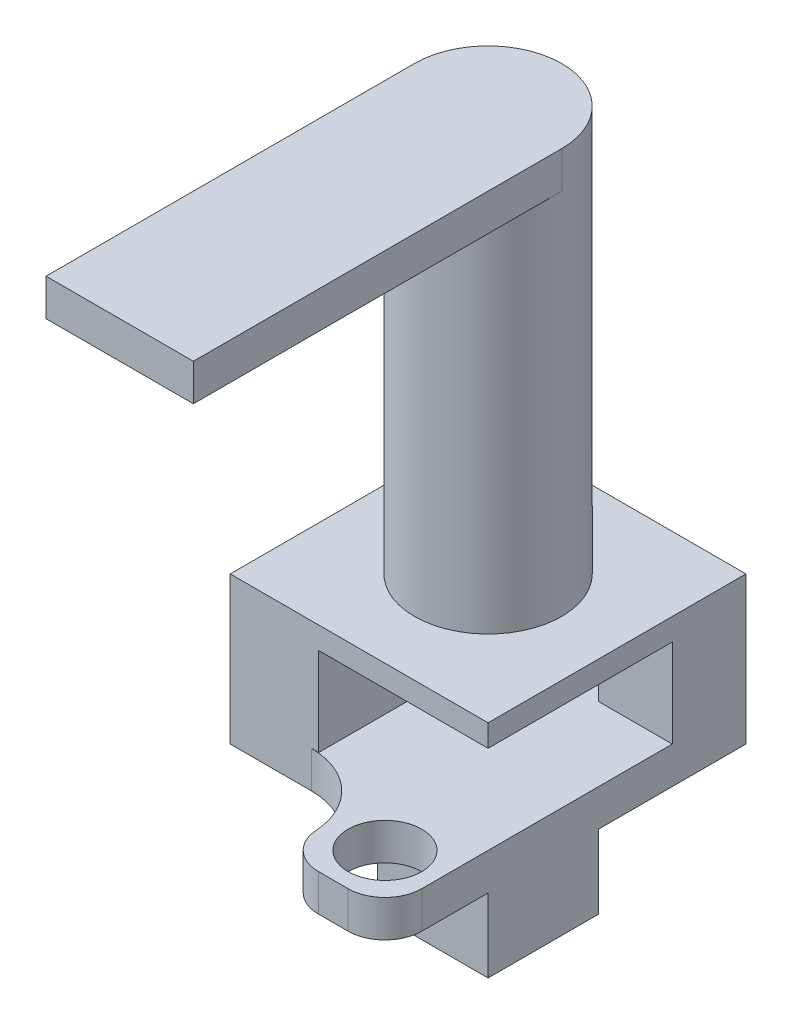
ISO-10303-21;
HEADER;
FILE_DESCRIPTION(('STEP AP214'),'2;1');
FILE_NAME('part.step','',(''),(''),'','','');
FILE_SCHEMA(('AUTOMOTIVE_DESIGN { 1 0 10303 214 1 1 1 1 }'));
ENDSEC;
DATA;
#1=APPLICATION_CONTEXT('core data for automotive mechanical design processes');
#2=APPLICATION_PROTOCOL_DEFINITION('international standard','automotive_design',2000,#1);
#3=PRODUCT_CONTEXT('',#1,'mechanical');
#4=PRODUCT('Part','Part','',(#3));
#5=PRODUCT_RELATED_PRODUCT_CATEGORY('part','',(#4));
#6=PRODUCT_DEFINITION_FORMATION('','',#4);
#7=PRODUCT_DEFINITION_CONTEXT('part definition',#1,'design');
#8=PRODUCT_DEFINITION('design','',#6,#7);
#9=PRODUCT_DEFINITION_SHAPE('','',#8);
#10=(LENGTH_UNIT() NAMED_UNIT(*) SI_UNIT(.MILLI.,.METRE.));
#11=(NAMED_UNIT(*) PLANE_ANGLE_UNIT() SI_UNIT($,.RADIAN.));
#12=(NAMED_UNIT(*) SI_UNIT($,.STERADIAN.) SOLID_ANGLE_UNIT());
#13=UNCERTAINTY_MEASURE_WITH_UNIT(LENGTH_MEASURE(1.E-05),#10,'distance_accuracy_value','');
#14=(GEOMETRIC_REPRESENTATION_CONTEXT(3) GLOBAL_UNCERTAINTY_ASSIGNED_CONTEXT((#13)) GLOBAL_UNIT_ASSIGNED_CONTEXT((#10,
#11,#12)) REPRESENTATION_CONTEXT('',''));
#15=CARTESIAN_POINT('',(0.,0.,0.));
#16=DIRECTION('',(0.,0.,1.));
#17=DIRECTION('',(1.,0.,0.));
#18=AXIS2_PLACEMENT_3D('',#15,#16,#17);
#19=CARTESIAN_POINT('',(21.,5.,0.));
#20=DIRECTION('',(0.,0.,-1.));
#21=DIRECTION('',(-1.,0.,0.));
#22=AXIS2_PLACEMENT_3D('',#19,#20,#21);
#23=PLANE('',#22);
#24=DIRECTION('',(-1.,0.,0.));
#25=VECTOR('',#24,1.);
#26=CARTESIAN_POINT('',(35.,0.,0.));
#27=LINE('',#26,#25);
#28=CARTESIAN_POINT('',(35.,0.,0.));
#29=VERTEX_POINT('',#28);
#30=CARTESIAN_POINT('',(20.,0.,0.));
#31=VERTEX_POINT('',#30);
#32=EDGE_CURVE('E336',#29,#31,#27,.T.);
#33=ORIENTED_EDGE('',*,*,#32,.T.);
#34=DIRECTION('',(0.,1.,0.));
#35=VECTOR('',#34,1.);
#36=CARTESIAN_POINT('',(20.,-10.,0.));
#37=LINE('',#36,#35);
#38=CARTESIAN_POINT('',(20.,-10.,0.));
#39=VERTEX_POINT('',#38);
#40=EDGE_CURVE('E378',#39,#31,#37,.T.);
#41=ORIENTED_EDGE('',*,*,#40,.F.);
#42=DIRECTION('',(-1.,0.,0.));
#43=VECTOR('',#42,1.);
#44=CARTESIAN_POINT('',(35.,-10.,0.));
#45=LINE('',#44,#43);
#46=CARTESIAN_POINT('',(35.,-10.,0.));
#47=VERTEX_POINT('',#46);
#48=EDGE_CURVE('E337',#47,#39,#45,.T.);
#49=ORIENTED_EDGE('',*,*,#48,.F.);
#50=DIRECTION('',(0.,1.,0.));
#51=VECTOR('',#50,1.);
#52=CARTESIAN_POINT('',(35.,-10.,0.));
#53=LINE('',#52,#51);
#54=EDGE_CURVE('E351',#47,#29,#53,.T.);
#55=ORIENTED_EDGE('',*,*,#54,.T.);
#56=EDGE_LOOP('',(#33,#41,#49,#55));
#57=FACE_BOUND('',#56,.T.);
#58=ADVANCED_FACE('F33',(#57),#23,.F.);
#59=CARTESIAN_POINT('',(0.,5.,0.));
#60=DIRECTION('',(0.,-1.,0.));
#61=DIRECTION('',(0.,0.,-1.));
#62=AXIS2_PLACEMENT_3D('',#59,#60,#61);
#63=PLANE('',#62);
#64=CARTESIAN_POINT('',(3.4292630032292,5.,-31.5398822652913));
#65=DIRECTION('',(0.,1.,0.));
#66=DIRECTION('',(0.,0.,1.));
#67=AXIS2_PLACEMENT_3D('',#64,#65,#66);
#68=CIRCLE('',#67,2.5);
#69=CARTESIAN_POINT('',(5.28246111025682,5.,-33.2178741532661));
#70=VERTEX_POINT('',#69);
#71=CARTESIAN_POINT('',(1.57606489620158,5.,-29.8618903773165));
#72=VERTEX_POINT('',#71);
#73=EDGE_CURVE('E388',#70,#72,#68,.T.);
#74=ORIENTED_EDGE('',*,*,#73,.F.);
#75=DIRECTION('',(-0.671196755189921,0.,-0.741279242811048));
#76=VECTOR('',#75,1.);
#77=CARTESIAN_POINT('',(5.28246111025682,5.,-33.2178741532661));
#78=LINE('',#77,#76);
#79=CARTESIAN_POINT('',(18.7063962140552,5.,-18.3922892970451));
#80=VERTEX_POINT('',#79);
#81=EDGE_CURVE('E396',#80,#70,#78,.T.);
#82=ORIENTED_EDGE('',*,*,#81,.F.);
#83=CARTESIAN_POINT('',(16.8531981070276,5.,-16.7142974090703));
#84=DIRECTION('',(0.,1.,0.));
#85=DIRECTION('',(0.,0.,1.));
#86=AXIS2_PLACEMENT_3D('',#83,#84,#85);
#87=CIRCLE('',#86,2.5);
#88=CARTESIAN_POINT('',(15.,5.,-15.0363055210955));
#89=VERTEX_POINT('',#88);
#90=EDGE_CURVE('E393',#89,#80,#87,.T.);
#91=ORIENTED_EDGE('',*,*,#90,.F.);
#92=DIRECTION('',(0.671196755189921,0.,0.741279242811048));
#93=VECTOR('',#92,1.);
#94=CARTESIAN_POINT('',(15.,5.,-15.0363055210955));
#95=LINE('',#94,#93);
#96=EDGE_CURVE('E390',#72,#89,#95,.T.);
#97=ORIENTED_EDGE('',*,*,#96,.F.);
#98=EDGE_LOOP('',(#74,#82,#91,#97));
#99=FACE_BOUND('',#98,.T.);
#100=CARTESIAN_POINT('',(28.,5.,7.));
#101=DIRECTION('',(0.,1.,0.));
#102=DIRECTION('',(0.,0.,1.));
#103=AXIS2_PLACEMENT_3D('',#100,#101,#102);
#104=CIRCLE('',#103,5.);
#105=CARTESIAN_POINT('',(28.,5.,12.));
#106=VERTEX_POINT('',#105);
#107=EDGE_CURVE('E382',#106,#106,#104,.T.);
#108=ORIENTED_EDGE('',*,*,#107,.F.);
#109=EDGE_LOOP('',(#108));
#110=FACE_BOUND('',#109,.T.);
#111=DIRECTION('',(1.,0.,0.));
#112=VECTOR('',#111,1.);
#113=CARTESIAN_POINT('',(35.,5.,14.));
#114=LINE('',#113,#112);
#115=CARTESIAN_POINT('',(25.9666295470958,5.,14.));
#116=VERTEX_POINT('',#115);
#117=CARTESIAN_POINT('',(30.,5.,14.));
#118=VERTEX_POINT('',#117);
#119=EDGE_CURVE('E419',#116,#118,#114,.T.);
#120=ORIENTED_EDGE('',*,*,#119,.T.);
#121=CARTESIAN_POINT('',(30.,5.,9.));
#122=DIRECTION('',(0.,-1.,0.));
#123=DIRECTION('',(0.,0.,-1.));
#124=AXIS2_PLACEMENT_3D('',#121,#122,#123);
#125=CIRCLE('',#124,5.);
#126=CARTESIAN_POINT('',(35.,5.,9.));
#127=VERTEX_POINT('',#126);
#128=EDGE_CURVE('E41',#118,#127,#125,.F.);
#129=ORIENTED_EDGE('',*,*,#128,.T.);
#130=DIRECTION('',(0.,0.,-1.));
#131=VECTOR('',#130,1.);
#132=CARTESIAN_POINT('',(35.,5.,0.));
#133=LINE('',#132,#131);
#134=CARTESIAN_POINT('',(35.,5.,-25.));
#135=VERTEX_POINT('',#134);
#136=EDGE_CURVE('E421',#127,#135,#133,.T.);
#137=ORIENTED_EDGE('',*,*,#136,.T.);
#138=DIRECTION('',(1.,0.,0.));
#139=VECTOR('',#138,1.);
#140=CARTESIAN_POINT('',(35.,5.,-25.));
#141=LINE('',#140,#139);
#142=CARTESIAN_POINT('',(25.,5.,-25.));
#143=VERTEX_POINT('',#142);
#144=EDGE_CURVE('E299',#143,#135,#141,.T.);
#145=ORIENTED_EDGE('',*,*,#144,.F.);
#146=DIRECTION('',(0.,0.,1.));
#147=VECTOR('',#146,1.);
#148=CARTESIAN_POINT('',(25.,5.,-35.));
#149=LINE('',#148,#147);
#150=CARTESIAN_POINT('',(25.,5.,-35.));
#151=VERTEX_POINT('',#150);
#152=EDGE_CURVE('E294',#151,#143,#149,.T.);
#153=ORIENTED_EDGE('',*,*,#152,.F.);
#154=DIRECTION('',(-1.,0.,0.));
#155=VECTOR('',#154,1.);
#156=CARTESIAN_POINT('',(35.,5.,-35.));
#157=LINE('',#156,#155);
#158=CARTESIAN_POINT('',(0.,5.,-35.));
#159=VERTEX_POINT('',#158);
#160=EDGE_CURVE('E424',#151,#159,#157,.T.);
#161=ORIENTED_EDGE('',*,*,#160,.T.);
#162=DIRECTION('',(0.,0.,1.));
#163=VECTOR('',#162,1.);
#164=CARTESIAN_POINT('',(0.,5.,0.));
#165=LINE('',#164,#163);
#166=CARTESIAN_POINT('',(0.,5.,-12.));
#167=VERTEX_POINT('',#166);
#168=EDGE_CURVE('E426',#159,#167,#165,.T.);
#169=ORIENTED_EDGE('',*,*,#168,.T.);
#170=DIRECTION('',(-1.,0.,0.));
#171=VECTOR('',#170,1.);
#172=CARTESIAN_POINT('',(0.,5.,-12.));
#173=LINE('',#172,#171);
#174=CARTESIAN_POINT('',(12.,5.,-12.));
#175=VERTEX_POINT('',#174);
#176=EDGE_CURVE('E320',#175,#167,#173,.T.);
#177=ORIENTED_EDGE('',*,*,#176,.F.);
#178=DIRECTION('',(0.,0.,-1.));
#179=VECTOR('',#178,1.);
#180=CARTESIAN_POINT('',(12.,5.,0.));
#181=LINE('',#180,#179);
#182=CARTESIAN_POINT('',(12.,5.,0.));
#183=VERTEX_POINT('',#182);
#184=EDGE_CURVE('E315',#183,#175,#181,.T.);
#185=ORIENTED_EDGE('',*,*,#184,.F.);
#186=DIRECTION('',(1.,0.,0.));
#187=VECTOR('',#186,1.);
#188=CARTESIAN_POINT('',(0.,5.,0.));
#189=LINE('',#188,#187);
#190=CARTESIAN_POINT('',(11.,5.,0.));
#191=VERTEX_POINT('',#190);
#192=EDGE_CURVE('E267',#191,#183,#189,.T.);
#193=ORIENTED_EDGE('',*,*,#192,.F.);
#194=CARTESIAN_POINT('',(11.,5.,10.));
#195=DIRECTION('',(0.,-1.,0.));
#196=DIRECTION('',(0.,0.,-1.));
#197=AXIS2_PLACEMENT_3D('',#194,#195,#196);
#198=CIRCLE('',#197,10.);
#199=CARTESIAN_POINT('',(20.9777530313972,5.,9.33333333333333));
#200=VERTEX_POINT('',#199);
#201=EDGE_CURVE('E453',#191,#200,#198,.T.);
#202=ORIENTED_EDGE('',*,*,#201,.T.);
#203=CARTESIAN_POINT('',(25.9666295470958,5.,9.));
#204=DIRECTION('',(0.,-1.,0.));
#205=DIRECTION('',(0.,0.,-1.));
#206=AXIS2_PLACEMENT_3D('',#203,#204,#205);
#207=CIRCLE('',#206,5.);
#208=EDGE_CURVE('E466',#200,#116,#207,.F.);
#209=ORIENTED_EDGE('',*,*,#208,.T.);
#210=EDGE_LOOP('',(#120,#129,#137,#145,#153,#161,#169,#177,#185,#193,#202,#209));
#211=FACE_BOUND('',#210,.T.);
#212=ADVANCED_FACE('F470',(#99,#110,#211),#63,.F.);
#213=CARTESIAN_POINT('',(0.,0.,0.));
#214=DIRECTION('',(0.,-1.,0.));
#215=DIRECTION('',(0.,0.,-1.));
#216=AXIS2_PLACEMENT_3D('',#213,#214,#215);
#217=PLANE('',#216);
#218=DIRECTION('',(0.,0.,-1.));
#219=VECTOR('',#218,1.);
#220=CARTESIAN_POINT('',(35.,0.,-35.));
#221=LINE('',#220,#219);
#222=CARTESIAN_POINT('',(35.,0.,9.));
#223=VERTEX_POINT('',#222);
#224=EDGE_CURVE('E435',#223,#29,#221,.T.);
#225=ORIENTED_EDGE('',*,*,#224,.F.);
#226=CARTESIAN_POINT('',(30.,0.,9.));
#227=DIRECTION('',(0.,-1.,0.));
#228=DIRECTION('',(0.,0.,-1.));
#229=AXIS2_PLACEMENT_3D('',#226,#227,#228);
#230=CIRCLE('',#229,5.);
#231=CARTESIAN_POINT('',(30.,0.,14.));
#232=VERTEX_POINT('',#231);
#233=EDGE_CURVE('E460',#223,#232,#230,.T.);
#234=ORIENTED_EDGE('',*,*,#233,.T.);
#235=DIRECTION('',(1.,0.,0.));
#236=VECTOR('',#235,1.);
#237=CARTESIAN_POINT('',(35.,0.,14.));
#238=LINE('',#237,#236);
#239=CARTESIAN_POINT('',(25.9666295470958,0.,14.));
#240=VERTEX_POINT('',#239);
#241=EDGE_CURVE('E432',#240,#232,#238,.T.);
#242=ORIENTED_EDGE('',*,*,#241,.F.);
#243=CARTESIAN_POINT('',(25.9666295470958,0.,9.));
#244=DIRECTION('',(0.,-1.,0.));
#245=DIRECTION('',(0.,0.,-1.));
#246=AXIS2_PLACEMENT_3D('',#243,#244,#245);
#247=CIRCLE('',#246,5.);
#248=CARTESIAN_POINT('',(20.9777530313972,0.,9.33333333333333));
#249=VERTEX_POINT('',#248);
#250=EDGE_CURVE('E458',#240,#249,#247,.T.);
#251=ORIENTED_EDGE('',*,*,#250,.T.);
#252=CARTESIAN_POINT('',(11.,0.,10.));
#253=DIRECTION('',(0.,-1.,0.));
#254=DIRECTION('',(0.,0.,-1.));
#255=AXIS2_PLACEMENT_3D('',#252,#253,#254);
#256=CIRCLE('',#255,10.);
#257=CARTESIAN_POINT('',(11.,0.,0.));
#258=VERTEX_POINT('',#257);
#259=EDGE_CURVE('E451',#249,#258,#256,.F.);
#260=ORIENTED_EDGE('',*,*,#259,.T.);
#261=DIRECTION('',(1.,0.,0.));
#262=VECTOR('',#261,1.);
#263=CARTESIAN_POINT('',(21.,0.,0.));
#264=LINE('',#263,#262);
#265=EDGE_CURVE('E418',#258,#31,#264,.T.);
#266=ORIENTED_EDGE('',*,*,#265,.T.);
#267=ORIENTED_EDGE('',*,*,#32,.F.);
#268=EDGE_LOOP('',(#225,#234,#242,#251,#260,#266,#267));
#269=FACE_BOUND('',#268,.T.);
#270=CARTESIAN_POINT('',(28.,0.,7.));
#271=DIRECTION('',(0.,1.,0.));
#272=DIRECTION('',(0.,0.,1.));
#273=AXIS2_PLACEMENT_3D('',#270,#271,#272);
#274=CIRCLE('',#273,5.);
#275=CARTESIAN_POINT('',(28.,0.,12.));
#276=VERTEX_POINT('',#275);
#277=EDGE_CURVE('E381',#276,#276,#274,.T.);
#278=ORIENTED_EDGE('',*,*,#277,.T.);
#279=EDGE_LOOP('',(#278));
#280=FACE_BOUND('',#279,.T.);
#281=ADVANCED_FACE('F479',(#269,#280),#217,.T.);
#282=DIRECTION('',(1.,0.,0.));
#283=VECTOR('',#282,1.);
#284=CARTESIAN_POINT('',(35.,0.,-15.));
#285=LINE('',#284,#283);
#286=CARTESIAN_POINT('',(30.,0.,-15.));
#287=VERTEX_POINT('',#286);
#288=CARTESIAN_POINT('',(35.,0.,-15.));
#289=VERTEX_POINT('',#288);
#290=EDGE_CURVE('E341',#287,#289,#285,.T.);
#291=ORIENTED_EDGE('',*,*,#290,.F.);
#292=DIRECTION('',(0.,0.,-1.));
#293=VECTOR('',#292,1.);
#294=CARTESIAN_POINT('',(30.,0.,-5.));
#295=LINE('',#294,#293);
#296=CARTESIAN_POINT('',(30.,0.,-5.));
#297=VERTEX_POINT('',#296);
#298=EDGE_CURVE('E359',#297,#287,#295,.T.);
#299=ORIENTED_EDGE('',*,*,#298,.F.);
#300=DIRECTION('',(1.,0.,0.));
#301=VECTOR('',#300,1.);
#302=CARTESIAN_POINT('',(30.,0.,-5.));
#303=LINE('',#302,#301);
#304=CARTESIAN_POINT('',(20.,0.,-5.));
#305=VERTEX_POINT('',#304);
#306=EDGE_CURVE('E356',#305,#297,#303,.T.);
#307=ORIENTED_EDGE('',*,*,#306,.F.);
#308=DIRECTION('',(0.,0.,-1.));
#309=VECTOR('',#308,1.);
#310=CARTESIAN_POINT('',(20.,0.,0.));
#311=LINE('',#310,#309);
#312=EDGE_CURVE('E353',#31,#305,#311,.T.);
#313=ORIENTED_EDGE('',*,*,#312,.F.);
#314=ORIENTED_EDGE('',*,*,#265,.F.);
#315=CARTESIAN_POINT('',(0.,0.,0.));
#316=VERTEX_POINT('',#315);
#317=EDGE_CURVE('E429',#316,#258,#264,.T.);
#318=ORIENTED_EDGE('',*,*,#317,.F.);
#319=DIRECTION('',(0.,0.,1.));
#320=VECTOR('',#319,1.);
#321=CARTESIAN_POINT('',(0.,0.,0.));
#322=LINE('',#321,#320);
#323=CARTESIAN_POINT('',(0.,0.,-35.));
#324=VERTEX_POINT('',#323);
#325=EDGE_CURVE('E422',#324,#316,#322,.T.);
#326=ORIENTED_EDGE('',*,*,#325,.F.);
#327=DIRECTION('',(-1.,0.,0.));
#328=VECTOR('',#327,1.);
#329=CARTESIAN_POINT('',(35.,0.,-35.));
#330=LINE('',#329,#328);
#331=CARTESIAN_POINT('',(35.,0.,-35.));
#332=VERTEX_POINT('',#331);
#333=EDGE_CURVE('E437',#332,#324,#330,.T.);
#334=ORIENTED_EDGE('',*,*,#333,.F.);
#335=EDGE_CURVE('E434',#289,#332,#221,.T.);
#336=ORIENTED_EDGE('',*,*,#335,.F.);
#337=EDGE_LOOP('',(#291,#299,#307,#313,#314,#318,#326,#334,#336));
#338=FACE_BOUND('',#337,.T.);
#339=DIRECTION('',(-0.671196755189921,0.,-0.741279242811048));
#340=VECTOR('',#339,1.);
#341=CARTESIAN_POINT('',(5.28246111025682,0.,-33.2178741532661));
#342=LINE('',#341,#340);
#343=CARTESIAN_POINT('',(18.7063962140552,0.,-18.3922892970451));
#344=VERTEX_POINT('',#343);
#345=CARTESIAN_POINT('',(5.28246111025681,0.,-33.2178741532661));
#346=VERTEX_POINT('',#345);
#347=EDGE_CURVE('E391',#344,#346,#342,.T.);
#348=ORIENTED_EDGE('',*,*,#347,.T.);
#349=CARTESIAN_POINT('',(3.4292630032292,0.,-31.5398822652913));
#350=DIRECTION('',(0.,1.,0.));
#351=DIRECTION('',(0.,0.,1.));
#352=AXIS2_PLACEMENT_3D('',#349,#350,#351);
#353=CIRCLE('',#352,2.5);
#354=CARTESIAN_POINT('',(1.57606489620158,0.,-29.8618903773165));
#355=VERTEX_POINT('',#354);
#356=EDGE_CURVE('E385',#346,#355,#353,.T.);
#357=ORIENTED_EDGE('',*,*,#356,.T.);
#358=DIRECTION('',(0.671196755189921,0.,0.741279242811048));
#359=VECTOR('',#358,1.);
#360=CARTESIAN_POINT('',(15.,0.,-15.0363055210955));
#361=LINE('',#360,#359);
#362=CARTESIAN_POINT('',(15.,0.,-15.0363055210955));
#363=VERTEX_POINT('',#362);
#364=EDGE_CURVE('E401',#355,#363,#361,.T.);
#365=ORIENTED_EDGE('',*,*,#364,.T.);
#366=CARTESIAN_POINT('',(16.8531981070276,0.,-16.7142974090703));
#367=DIRECTION('',(0.,1.,0.));
#368=DIRECTION('',(0.,0.,1.));
#369=AXIS2_PLACEMENT_3D('',#366,#367,#368);
#370=CIRCLE('',#369,2.5);
#371=EDGE_CURVE('E404',#363,#344,#370,.T.);
#372=ORIENTED_EDGE('',*,*,#371,.T.);
#373=EDGE_LOOP('',(#348,#357,#365,#372));
#374=FACE_BOUND('',#373,.T.);
#375=ADVANCED_FACE('F497',(#338,#374),#217,.T.);
#376=ORIENTED_EDGE('',*,*,#317,.T.);
#377=DIRECTION('',(0.,-1.,0.));
#378=VECTOR('',#377,1.);
#379=CARTESIAN_POINT('',(11.,5.,0.));
#380=LINE('',#379,#378);
#381=EDGE_CURVE('E448',#258,#191,#380,.F.);
#382=ORIENTED_EDGE('',*,*,#381,.T.);
#383=ORIENTED_EDGE('',*,*,#192,.T.);
#384=DIRECTION('',(0.,-1.,0.));
#385=VECTOR('',#384,1.);
#386=CARTESIAN_POINT('',(12.,17.,0.));
#387=LINE('',#386,#385);
#388=CARTESIAN_POINT('',(12.,17.,0.));
#389=VERTEX_POINT('',#388);
#390=EDGE_CURVE('E333',#389,#183,#387,.T.);
#391=ORIENTED_EDGE('',*,*,#390,.F.);
#392=DIRECTION('',(1.,0.,0.));
#393=VECTOR('',#392,1.);
#394=CARTESIAN_POINT('',(0.,17.,0.));
#395=LINE('',#394,#393);
#396=CARTESIAN_POINT('',(35.,17.,0.));
#397=VERTEX_POINT('',#396);
#398=EDGE_CURVE('E283',#389,#397,#395,.T.);
#399=ORIENTED_EDGE('',*,*,#398,.T.);
#400=DIRECTION('',(0.,-1.,0.));
#401=VECTOR('',#400,1.);
#402=CARTESIAN_POINT('',(35.,20.,0.));
#403=LINE('',#402,#401);
#404=CARTESIAN_POINT('',(35.,20.,0.));
#405=VERTEX_POINT('',#404);
#406=EDGE_CURVE('E291',#405,#397,#403,.T.);
#407=ORIENTED_EDGE('',*,*,#406,.F.);
#408=DIRECTION('',(1.,0.,0.));
#409=VECTOR('',#408,1.);
#410=CARTESIAN_POINT('',(0.,20.,0.));
#411=LINE('',#410,#409);
#412=CARTESIAN_POINT('',(0.,20.,0.));
#413=VERTEX_POINT('',#412);
#414=EDGE_CURVE('E272',#413,#405,#411,.T.);
#415=ORIENTED_EDGE('',*,*,#414,.F.);
#416=DIRECTION('',(0.,-1.,0.));
#417=VECTOR('',#416,1.);
#418=CARTESIAN_POINT('',(0.,5.,0.));
#419=LINE('',#418,#417);
#420=EDGE_CURVE('E428',#413,#316,#419,.T.);
#421=ORIENTED_EDGE('',*,*,#420,.T.);
#422=EDGE_LOOP('',(#376,#382,#383,#391,#399,#407,#415,#421));
#423=FACE_BOUND('',#422,.T.);
#424=ADVANCED_FACE('F491',(#423),#23,.F.);
#425=CARTESIAN_POINT('',(35.,5.,14.));
#426=DIRECTION('',(0.,0.,-1.));
#427=DIRECTION('',(-1.,0.,0.));
#428=AXIS2_PLACEMENT_3D('',#425,#426,#427);
#429=PLANE('',#428);
#430=ORIENTED_EDGE('',*,*,#241,.T.);
#431=DIRECTION('',(0.,-1.,0.));
#432=VECTOR('',#431,1.);
#433=CARTESIAN_POINT('',(30.,5.,14.));
#434=LINE('',#433,#432);
#435=EDGE_CURVE('E54',#232,#118,#434,.F.);
#436=ORIENTED_EDGE('',*,*,#435,.T.);
#437=ORIENTED_EDGE('',*,*,#119,.F.);
#438=DIRECTION('',(0.,1.,0.));
#439=VECTOR('',#438,1.);
#440=CARTESIAN_POINT('',(25.9666295470958,5.,14.));
#441=LINE('',#440,#439);
#442=EDGE_CURVE('E462',#116,#240,#441,.F.);
#443=ORIENTED_EDGE('',*,*,#442,.T.);
#444=EDGE_LOOP('',(#430,#436,#437,#443));
#445=FACE_BOUND('',#444,.T.);
#446=ADVANCED_FACE('F482',(#445),#429,.F.);
#447=CARTESIAN_POINT('',(35.,5.,-35.));
#448=DIRECTION('',(-1.,0.,0.));
#449=DIRECTION('',(0.,0.,1.));
#450=AXIS2_PLACEMENT_3D('',#447,#448,#449);
#451=PLANE('',#450);
#452=ORIENTED_EDGE('',*,*,#136,.F.);
#453=DIRECTION('',(0.,-1.,0.));
#454=VECTOR('',#453,1.);
#455=CARTESIAN_POINT('',(35.,5.,9.));
#456=LINE('',#455,#454);
#457=EDGE_CURVE('E455',#127,#223,#456,.T.);
#458=ORIENTED_EDGE('',*,*,#457,.T.);
#459=ORIENTED_EDGE('',*,*,#224,.T.);
#460=ORIENTED_EDGE('',*,*,#54,.F.);
#461=DIRECTION('',(0.,0.,1.));
#462=VECTOR('',#461,1.);
#463=CARTESIAN_POINT('',(35.,-10.,-15.));
#464=LINE('',#463,#462);
#465=CARTESIAN_POINT('',(35.,-10.,-15.));
#466=VERTEX_POINT('',#465);
#467=EDGE_CURVE('E349',#466,#47,#464,.T.);
#468=ORIENTED_EDGE('',*,*,#467,.F.);
#469=DIRECTION('',(0.,1.,0.));
#470=VECTOR('',#469,1.);
#471=CARTESIAN_POINT('',(35.,-10.,-15.));
#472=LINE('',#471,#470);
#473=EDGE_CURVE('E366',#466,#289,#472,.T.);
#474=ORIENTED_EDGE('',*,*,#473,.T.);
#475=ORIENTED_EDGE('',*,*,#335,.T.);
#476=DIRECTION('',(0.,-1.,0.));
#477=VECTOR('',#476,1.);
#478=CARTESIAN_POINT('',(35.,5.,-35.));
#479=LINE('',#478,#477);
#480=CARTESIAN_POINT('',(35.,20.,-35.));
#481=VERTEX_POINT('',#480);
#482=EDGE_CURVE('E268',#481,#332,#479,.T.);
#483=ORIENTED_EDGE('',*,*,#482,.F.);
#484=DIRECTION('',(0.,0.,-1.));
#485=VECTOR('',#484,1.);
#486=CARTESIAN_POINT('',(35.,20.,0.));
#487=LINE('',#486,#485);
#488=EDGE_CURVE('E275',#405,#481,#487,.T.);
#489=ORIENTED_EDGE('',*,*,#488,.F.);
#490=ORIENTED_EDGE('',*,*,#406,.T.);
#491=DIRECTION('',(0.,0.,-1.));
#492=VECTOR('',#491,1.);
#493=CARTESIAN_POINT('',(35.,17.,0.));
#494=LINE('',#493,#492);
#495=CARTESIAN_POINT('',(35.,17.,-25.));
#496=VERTEX_POINT('',#495);
#497=EDGE_CURVE('E285',#397,#496,#494,.T.);
#498=ORIENTED_EDGE('',*,*,#497,.T.);
#499=DIRECTION('',(0.,-1.,0.));
#500=VECTOR('',#499,1.);
#501=CARTESIAN_POINT('',(35.,17.,-25.));
#502=LINE('',#501,#500);
#503=EDGE_CURVE('E302',#496,#135,#502,.T.);
#504=ORIENTED_EDGE('',*,*,#503,.T.);
#505=EDGE_LOOP('',(#452,#458,#459,#460,#468,#474,#475,#483,#489,#490,#498,#504));
#506=FACE_BOUND('',#505,.T.);
#507=ADVANCED_FACE('F474',(#506),#451,.F.);
#508=CARTESIAN_POINT('',(35.,5.,-35.));
#509=DIRECTION('',(0.,0.,1.));
#510=DIRECTION('',(1.,0.,0.));
#511=AXIS2_PLACEMENT_3D('',#508,#509,#510);
#512=PLANE('',#511);
#513=ORIENTED_EDGE('',*,*,#333,.T.);
#514=DIRECTION('',(0.,-1.,0.));
#515=VECTOR('',#514,1.);
#516=CARTESIAN_POINT('',(0.,5.,-35.));
#517=LINE('',#516,#515);
#518=EDGE_CURVE('E442',#159,#324,#517,.T.);
#519=ORIENTED_EDGE('',*,*,#518,.F.);
#520=ORIENTED_EDGE('',*,*,#160,.F.);
#521=DIRECTION('',(0.,-1.,0.));
#522=VECTOR('',#521,1.);
#523=CARTESIAN_POINT('',(25.,17.,-35.));
#524=LINE('',#523,#522);
#525=CARTESIAN_POINT('',(25.,17.,-35.));
#526=VERTEX_POINT('',#525);
#527=EDGE_CURVE('E312',#526,#151,#524,.T.);
#528=ORIENTED_EDGE('',*,*,#527,.F.);
#529=DIRECTION('',(-1.,0.,0.));
#530=VECTOR('',#529,1.);
#531=CARTESIAN_POINT('',(0.,17.,-35.));
#532=LINE('',#531,#530);
#533=CARTESIAN_POINT('',(0.,17.,-35.));
#534=VERTEX_POINT('',#533);
#535=EDGE_CURVE('E273',#526,#534,#532,.T.);
#536=ORIENTED_EDGE('',*,*,#535,.T.);
#537=DIRECTION('',(0.,-1.,0.));
#538=VECTOR('',#537,1.);
#539=CARTESIAN_POINT('',(0.,20.,-35.));
#540=LINE('',#539,#538);
#541=CARTESIAN_POINT('',(0.,20.,-35.));
#542=VERTEX_POINT('',#541);
#543=EDGE_CURVE('E280',#542,#534,#540,.T.);
#544=ORIENTED_EDGE('',*,*,#543,.F.);
#545=DIRECTION('',(-1.,0.,0.));
#546=VECTOR('',#545,1.);
#547=CARTESIAN_POINT('',(0.,20.,-35.));
#548=LINE('',#547,#546);
#549=EDGE_CURVE('E278',#481,#542,#548,.T.);
#550=ORIENTED_EDGE('',*,*,#549,.F.);
#551=ORIENTED_EDGE('',*,*,#482,.T.);
#552=EDGE_LOOP('',(#513,#519,#520,#528,#536,#544,#550,#551));
#553=FACE_BOUND('',#552,.T.);
#554=ADVANCED_FACE('F558',(#553),#512,.F.);
#555=CARTESIAN_POINT('',(0.,5.,0.));
#556=DIRECTION('',(1.,0.,0.));
#557=DIRECTION('',(0.,0.,-1.));
#558=AXIS2_PLACEMENT_3D('',#555,#556,#557);
#559=PLANE('',#558);
#560=ORIENTED_EDGE('',*,*,#325,.T.);
#561=ORIENTED_EDGE('',*,*,#420,.F.);
#562=DIRECTION('',(0.,0.,1.));
#563=VECTOR('',#562,1.);
#564=CARTESIAN_POINT('',(0.,20.,0.));
#565=LINE('',#564,#563);
#566=EDGE_CURVE('E269',#542,#413,#565,.T.);
#567=ORIENTED_EDGE('',*,*,#566,.F.);
#568=ORIENTED_EDGE('',*,*,#543,.T.);
#569=DIRECTION('',(0.,0.,1.));
#570=VECTOR('',#569,1.);
#571=CARTESIAN_POINT('',(0.,17.,0.));
#572=LINE('',#571,#570);
#573=CARTESIAN_POINT('',(0.,17.,-12.));
#574=VERTEX_POINT('',#573);
#575=EDGE_CURVE('E258',#534,#574,#572,.T.);
#576=ORIENTED_EDGE('',*,*,#575,.T.);
#577=DIRECTION('',(0.,-1.,0.));
#578=VECTOR('',#577,1.);
#579=CARTESIAN_POINT('',(0.,17.,-12.));
#580=LINE('',#579,#578);
#581=EDGE_CURVE('E323',#574,#167,#580,.T.);
#582=ORIENTED_EDGE('',*,*,#581,.T.);
#583=ORIENTED_EDGE('',*,*,#168,.F.);
#584=ORIENTED_EDGE('',*,*,#518,.T.);
#585=EDGE_LOOP('',(#560,#561,#567,#568,#576,#582,#583,#584));
#586=FACE_BOUND('',#585,.T.);
#587=ADVANCED_FACE('F554',(#586),#559,.F.);
#588=CARTESIAN_POINT('',(3.4292630032292,5.,-31.5398822652913));
#589=DIRECTION('',(0.,-1.,0.));
#590=DIRECTION('',(0.,0.,-1.));
#591=AXIS2_PLACEMENT_3D('',#588,#589,#590);
#592=CYLINDRICAL_SURFACE('',#591,2.5);
#593=ORIENTED_EDGE('',*,*,#356,.F.);
#594=DIRECTION('',(0.,-1.,0.));
#595=VECTOR('',#594,1.);
#596=CARTESIAN_POINT('',(5.28246111025682,5.,-33.2178741532661));
#597=LINE('',#596,#595);
#598=EDGE_CURVE('E398',#70,#346,#597,.T.);
#599=ORIENTED_EDGE('',*,*,#598,.F.);
#600=ORIENTED_EDGE('',*,*,#73,.T.);
#601=DIRECTION('',(0.,-1.,0.));
#602=VECTOR('',#601,1.);
#603=CARTESIAN_POINT('',(1.57606489620158,5.,-29.8618903773165));
#604=LINE('',#603,#602);
#605=EDGE_CURVE('E415',#72,#355,#604,.T.);
#606=ORIENTED_EDGE('',*,*,#605,.T.);
#607=EDGE_LOOP('',(#593,#599,#600,#606));
#608=FACE_BOUND('',#607,.T.);
#609=ADVANCED_FACE('F557',(#608),#592,.F.);
#610=CARTESIAN_POINT('',(15.,5.,-15.0363055210955));
#611=DIRECTION('',(0.741279242811048,0.,-0.671196755189921));
#612=DIRECTION('',(-0.671196755189921,0.,-0.741279242811048));
#613=AXIS2_PLACEMENT_3D('',#610,#611,#612);
#614=PLANE('',#613);
#615=ORIENTED_EDGE('',*,*,#364,.F.);
#616=ORIENTED_EDGE('',*,*,#605,.F.);
#617=ORIENTED_EDGE('',*,*,#96,.T.);
#618=DIRECTION('',(0.,-1.,0.));
#619=VECTOR('',#618,1.);
#620=CARTESIAN_POINT('',(15.,5.,-15.0363055210955));
#621=LINE('',#620,#619);
#622=EDGE_CURVE('E413',#89,#363,#621,.T.);
#623=ORIENTED_EDGE('',*,*,#622,.T.);
#624=EDGE_LOOP('',(#615,#616,#617,#623));
#625=FACE_BOUND('',#624,.T.);
#626=ADVANCED_FACE('F585',(#625),#614,.T.);
#627=CARTESIAN_POINT('',(16.8531981070276,5.,-16.7142974090703));
#628=DIRECTION('',(0.,-1.,0.));
#629=DIRECTION('',(0.,0.,-1.));
#630=AXIS2_PLACEMENT_3D('',#627,#628,#629);
#631=CYLINDRICAL_SURFACE('',#630,2.5);
#632=ORIENTED_EDGE('',*,*,#371,.F.);
#633=ORIENTED_EDGE('',*,*,#622,.F.);
#634=ORIENTED_EDGE('',*,*,#90,.T.);
#635=DIRECTION('',(0.,-1.,0.));
#636=VECTOR('',#635,1.);
#637=CARTESIAN_POINT('',(18.7063962140552,5.,-18.3922892970451));
#638=LINE('',#637,#636);
#639=EDGE_CURVE('E411',#80,#344,#638,.T.);
#640=ORIENTED_EDGE('',*,*,#639,.T.);
#641=EDGE_LOOP('',(#632,#633,#634,#640));
#642=FACE_BOUND('',#641,.T.);
#643=ADVANCED_FACE('F592',(#642),#631,.F.);
#644=CARTESIAN_POINT('',(5.28246111025682,5.,-33.2178741532661));
#645=DIRECTION('',(-0.741279242811048,0.,0.671196755189921));
#646=DIRECTION('',(0.671196755189921,0.,0.741279242811048));
#647=AXIS2_PLACEMENT_3D('',#644,#645,#646);
#648=PLANE('',#647);
#649=ORIENTED_EDGE('',*,*,#347,.F.);
#650=ORIENTED_EDGE('',*,*,#639,.F.);
#651=ORIENTED_EDGE('',*,*,#81,.T.);
#652=ORIENTED_EDGE('',*,*,#598,.T.);
#653=EDGE_LOOP('',(#649,#650,#651,#652));
#654=FACE_BOUND('',#653,.T.);
#655=ADVANCED_FACE('F531',(#654),#648,.T.);
#656=CARTESIAN_POINT('',(28.,5.,7.));
#657=DIRECTION('',(0.,-1.,0.));
#658=DIRECTION('',(0.,0.,-1.));
#659=AXIS2_PLACEMENT_3D('',#656,#657,#658);
#660=CYLINDRICAL_SURFACE('',#659,5.);
#661=ORIENTED_EDGE('',*,*,#107,.T.);
#662=EDGE_LOOP('',(#661));
#663=FACE_BOUND('',#662,.T.);
#664=ORIENTED_EDGE('',*,*,#277,.F.);
#665=EDGE_LOOP('',(#664));
#666=FACE_BOUND('',#665,.T.);
#667=ADVANCED_FACE('F524',(#663,#666),#660,.F.);
#668=CARTESIAN_POINT('',(20.,-10.,0.));
#669=DIRECTION('',(1.,0.,0.));
#670=DIRECTION('',(0.,0.,-1.));
#671=AXIS2_PLACEMENT_3D('',#668,#669,#670);
#672=PLANE('',#671);
#673=ORIENTED_EDGE('',*,*,#312,.T.);
#674=DIRECTION('',(0.,1.,0.));
#675=VECTOR('',#674,1.);
#676=CARTESIAN_POINT('',(20.,-10.,-5.));
#677=LINE('',#676,#675);
#678=CARTESIAN_POINT('',(20.,-10.,-5.));
#679=VERTEX_POINT('',#678);
#680=EDGE_CURVE('E375',#679,#305,#677,.T.);
#681=ORIENTED_EDGE('',*,*,#680,.F.);
#682=DIRECTION('',(0.,0.,-1.));
#683=VECTOR('',#682,1.);
#684=CARTESIAN_POINT('',(20.,-10.,0.));
#685=LINE('',#684,#683);
#686=EDGE_CURVE('E340',#39,#679,#685,.T.);
#687=ORIENTED_EDGE('',*,*,#686,.F.);
#688=ORIENTED_EDGE('',*,*,#40,.T.);
#689=EDGE_LOOP('',(#673,#681,#687,#688));
#690=FACE_BOUND('',#689,.T.);
#691=ADVANCED_FACE('F522',(#690),#672,.F.);
#692=CARTESIAN_POINT('',(30.,-10.,-5.));
#693=DIRECTION('',(0.,0.,1.));
#694=DIRECTION('',(1.,0.,0.));
#695=AXIS2_PLACEMENT_3D('',#692,#693,#694);
#696=PLANE('',#695);
#697=ORIENTED_EDGE('',*,*,#306,.T.);
#698=DIRECTION('',(0.,1.,0.));
#699=VECTOR('',#698,1.);
#700=CARTESIAN_POINT('',(30.,-10.,-5.));
#701=LINE('',#700,#699);
#702=CARTESIAN_POINT('',(30.,-10.,-5.));
#703=VERTEX_POINT('',#702);
#704=EDGE_CURVE('E372',#703,#297,#701,.T.);
#705=ORIENTED_EDGE('',*,*,#704,.F.);
#706=DIRECTION('',(1.,0.,0.));
#707=VECTOR('',#706,1.);
#708=CARTESIAN_POINT('',(30.,-10.,-5.));
#709=LINE('',#708,#707);
#710=EDGE_CURVE('E343',#679,#703,#709,.T.);
#711=ORIENTED_EDGE('',*,*,#710,.F.);
#712=ORIENTED_EDGE('',*,*,#680,.T.);
#713=EDGE_LOOP('',(#697,#705,#711,#712));
#714=FACE_BOUND('',#713,.T.);
#715=ADVANCED_FACE('F519',(#714),#696,.F.);
#716=CARTESIAN_POINT('',(30.,-10.,-5.));
#717=DIRECTION('',(1.,0.,0.));
#718=DIRECTION('',(0.,0.,-1.));
#719=AXIS2_PLACEMENT_3D('',#716,#717,#718);
#720=PLANE('',#719);
#721=ORIENTED_EDGE('',*,*,#298,.T.);
#722=DIRECTION('',(0.,1.,0.));
#723=VECTOR('',#722,1.);
#724=CARTESIAN_POINT('',(30.,-10.,-15.));
#725=LINE('',#724,#723);
#726=CARTESIAN_POINT('',(30.,-10.,-15.));
#727=VERTEX_POINT('',#726);
#728=EDGE_CURVE('E369',#727,#287,#725,.T.);
#729=ORIENTED_EDGE('',*,*,#728,.F.);
#730=DIRECTION('',(0.,0.,-1.));
#731=VECTOR('',#730,1.);
#732=CARTESIAN_POINT('',(30.,-10.,-5.));
#733=LINE('',#732,#731);
#734=EDGE_CURVE('E345',#703,#727,#733,.T.);
#735=ORIENTED_EDGE('',*,*,#734,.F.);
#736=ORIENTED_EDGE('',*,*,#704,.T.);
#737=EDGE_LOOP('',(#721,#729,#735,#736));
#738=FACE_BOUND('',#737,.T.);
#739=ADVANCED_FACE('F515',(#738),#720,.F.);
#740=CARTESIAN_POINT('',(35.,-10.,-15.));
#741=DIRECTION('',(0.,0.,1.));
#742=DIRECTION('',(1.,0.,0.));
#743=AXIS2_PLACEMENT_3D('',#740,#741,#742);
#744=PLANE('',#743);
#745=ORIENTED_EDGE('',*,*,#290,.T.);
#746=ORIENTED_EDGE('',*,*,#473,.F.);
#747=DIRECTION('',(1.,0.,0.));
#748=VECTOR('',#747,1.);
#749=CARTESIAN_POINT('',(35.,-10.,-15.));
#750=LINE('',#749,#748);
#751=EDGE_CURVE('E347',#727,#466,#750,.T.);
#752=ORIENTED_EDGE('',*,*,#751,.F.);
#753=ORIENTED_EDGE('',*,*,#728,.T.);
#754=EDGE_LOOP('',(#745,#746,#752,#753));
#755=FACE_BOUND('',#754,.T.);
#756=ADVANCED_FACE('F513',(#755),#744,.F.);
#757=CARTESIAN_POINT('',(0.,-10.,0.));
#758=DIRECTION('',(0.,-1.,0.));
#759=DIRECTION('',(0.,0.,-1.));
#760=AXIS2_PLACEMENT_3D('',#757,#758,#759);
#761=PLANE('',#760);
#762=ORIENTED_EDGE('',*,*,#48,.T.);
#763=ORIENTED_EDGE('',*,*,#686,.T.);
#764=ORIENTED_EDGE('',*,*,#710,.T.);
#765=ORIENTED_EDGE('',*,*,#734,.T.);
#766=ORIENTED_EDGE('',*,*,#751,.T.);
#767=ORIENTED_EDGE('',*,*,#467,.T.);
#768=EDGE_LOOP('',(#762,#763,#764,#765,#766,#767));
#769=FACE_BOUND('',#768,.T.);
#770=ADVANCED_FACE('F508',(#769),#761,.T.);
#771=CARTESIAN_POINT('',(12.,17.,0.));
#772=DIRECTION('',(-1.,0.,0.));
#773=DIRECTION('',(0.,0.,1.));
#774=AXIS2_PLACEMENT_3D('',#771,#772,#773);
#775=PLANE('',#774);
#776=ORIENTED_EDGE('',*,*,#184,.T.);
#777=DIRECTION('',(0.,-1.,0.));
#778=VECTOR('',#777,1.);
#779=CARTESIAN_POINT('',(12.,17.,-12.));
#780=LINE('',#779,#778);
#781=CARTESIAN_POINT('',(12.,17.,-12.));
#782=VERTEX_POINT('',#781);
#783=EDGE_CURVE('E330',#782,#175,#780,.T.);
#784=ORIENTED_EDGE('',*,*,#783,.F.);
#785=DIRECTION('',(0.,0.,-1.));
#786=VECTOR('',#785,1.);
#787=CARTESIAN_POINT('',(12.,17.,0.));
#788=LINE('',#787,#786);
#789=EDGE_CURVE('E316',#389,#782,#788,.T.);
#790=ORIENTED_EDGE('',*,*,#789,.F.);
#791=ORIENTED_EDGE('',*,*,#390,.T.);
#792=EDGE_LOOP('',(#776,#784,#790,#791));
#793=FACE_BOUND('',#792,.T.);
#794=ADVANCED_FACE('F643',(#793),#775,.F.);
#795=CARTESIAN_POINT('',(0.,17.,-12.));
#796=DIRECTION('',(0.,0.,1.));
#797=DIRECTION('',(1.,0.,0.));
#798=AXIS2_PLACEMENT_3D('',#795,#796,#797);
#799=PLANE('',#798);
#800=ORIENTED_EDGE('',*,*,#176,.T.);
#801=ORIENTED_EDGE('',*,*,#581,.F.);
#802=DIRECTION('',(-1.,0.,0.));
#803=VECTOR('',#802,1.);
#804=CARTESIAN_POINT('',(0.,17.,-12.));
#805=LINE('',#804,#803);
#806=EDGE_CURVE('E319',#782,#574,#805,.T.);
#807=ORIENTED_EDGE('',*,*,#806,.F.);
#808=ORIENTED_EDGE('',*,*,#783,.T.);
#809=EDGE_LOOP('',(#800,#801,#807,#808));
#810=FACE_BOUND('',#809,.T.);
#811=ADVANCED_FACE('F652',(#810),#799,.F.);
#812=CARTESIAN_POINT('',(25.,17.,-35.));
#813=DIRECTION('',(1.,0.,0.));
#814=DIRECTION('',(0.,0.,-1.));
#815=AXIS2_PLACEMENT_3D('',#812,#813,#814);
#816=PLANE('',#815);
#817=ORIENTED_EDGE('',*,*,#152,.T.);
#818=DIRECTION('',(0.,-1.,0.));
#819=VECTOR('',#818,1.);
#820=CARTESIAN_POINT('',(25.,17.,-25.));
#821=LINE('',#820,#819);
#822=CARTESIAN_POINT('',(25.,17.,-25.));
#823=VERTEX_POINT('',#822);
#824=EDGE_CURVE('E309',#823,#143,#821,.T.);
#825=ORIENTED_EDGE('',*,*,#824,.F.);
#826=DIRECTION('',(0.,0.,1.));
#827=VECTOR('',#826,1.);
#828=CARTESIAN_POINT('',(25.,17.,-35.));
#829=LINE('',#828,#827);
#830=EDGE_CURVE('E295',#526,#823,#829,.T.);
#831=ORIENTED_EDGE('',*,*,#830,.F.);
#832=ORIENTED_EDGE('',*,*,#527,.T.);
#833=EDGE_LOOP('',(#817,#825,#831,#832));
#834=FACE_BOUND('',#833,.T.);
#835=ADVANCED_FACE('F660',(#834),#816,.F.);
#836=CARTESIAN_POINT('',(35.,17.,-25.));
#837=DIRECTION('',(0.,0.,-1.));
#838=DIRECTION('',(-1.,0.,0.));
#839=AXIS2_PLACEMENT_3D('',#836,#837,#838);
#840=PLANE('',#839);
#841=ORIENTED_EDGE('',*,*,#144,.T.);
#842=ORIENTED_EDGE('',*,*,#503,.F.);
#843=DIRECTION('',(1.,0.,0.));
#844=VECTOR('',#843,1.);
#845=CARTESIAN_POINT('',(35.,17.,-25.));
#846=LINE('',#845,#844);
#847=EDGE_CURVE('E298',#823,#496,#846,.T.);
#848=ORIENTED_EDGE('',*,*,#847,.F.);
#849=ORIENTED_EDGE('',*,*,#824,.T.);
#850=EDGE_LOOP('',(#841,#842,#848,#849));
#851=FACE_BOUND('',#850,.T.);
#852=ADVANCED_FACE('F668',(#851),#840,.F.);
#853=CARTESIAN_POINT('',(0.,20.,0.));
#854=DIRECTION('',(0.,-1.,0.));
#855=DIRECTION('',(0.,0.,-1.));
#856=AXIS2_PLACEMENT_3D('',#853,#854,#855);
#857=PLANE('',#856);
#858=CARTESIAN_POINT('',(17.5,20.,-17.5));
#859=DIRECTION('',(0.,1.,0.));
#860=DIRECTION('',(0.,0.,1.));
#861=AXIS2_PLACEMENT_3D('',#858,#859,#860);
#862=CIRCLE('',#861,10.);
#863=CARTESIAN_POINT('',(17.5,20.,-7.49999999999999));
#864=VERTEX_POINT('',#863);
#865=EDGE_CURVE('E264',#864,#864,#862,.T.);
#866=ORIENTED_EDGE('',*,*,#865,.F.);
#867=EDGE_LOOP('',(#866));
#868=FACE_BOUND('',#867,.T.);
#869=ORIENTED_EDGE('',*,*,#566,.T.);
#870=ORIENTED_EDGE('',*,*,#414,.T.);
#871=ORIENTED_EDGE('',*,*,#488,.T.);
#872=ORIENTED_EDGE('',*,*,#549,.T.);
#873=EDGE_LOOP('',(#869,#870,#871,#872));
#874=FACE_BOUND('',#873,.T.);
#875=ADVANCED_FACE('F676',(#868,#874),#857,.F.);
#876=CARTESIAN_POINT('',(0.,17.,0.));
#877=DIRECTION('',(0.,-1.,0.));
#878=DIRECTION('',(0.,0.,-1.));
#879=AXIS2_PLACEMENT_3D('',#876,#877,#878);
#880=PLANE('',#879);
#881=ORIENTED_EDGE('',*,*,#398,.F.);
#882=ORIENTED_EDGE('',*,*,#789,.T.);
#883=ORIENTED_EDGE('',*,*,#806,.T.);
#884=ORIENTED_EDGE('',*,*,#575,.F.);
#885=ORIENTED_EDGE('',*,*,#535,.F.);
#886=ORIENTED_EDGE('',*,*,#830,.T.);
#887=ORIENTED_EDGE('',*,*,#847,.T.);
#888=ORIENTED_EDGE('',*,*,#497,.F.);
#889=EDGE_LOOP('',(#881,#882,#883,#884,#885,#886,#887,#888));
#890=FACE_BOUND('',#889,.T.);
#891=ADVANCED_FACE('F685',(#890),#880,.T.);
#892=CARTESIAN_POINT('',(17.5,70.,-17.5));
#893=DIRECTION('',(0.,-1.,0.));
#894=DIRECTION('',(0.,0.,-1.));
#895=AXIS2_PLACEMENT_3D('',#892,#893,#894);
#896=CYLINDRICAL_SURFACE('',#895,10.);
#897=CARTESIAN_POINT('',(17.5,70.,-17.5));
#898=DIRECTION('',(0.,1.,0.));
#899=DIRECTION('',(0.,0.,1.));
#900=AXIS2_PLACEMENT_3D('',#897,#898,#899);
#901=CIRCLE('',#900,10.);
#902=CARTESIAN_POINT('',(7.49999999999999,70.,-17.5));
#903=VERTEX_POINT('',#902);
#904=CARTESIAN_POINT('',(27.5,70.,-17.5));
#905=VERTEX_POINT('',#904);
#906=EDGE_CURVE('E255',#903,#905,#901,.T.);
#907=ORIENTED_EDGE('',*,*,#906,.F.);
#908=DIRECTION('',(0.,-1.,0.));
#909=VECTOR('',#908,1.);
#910=CARTESIAN_POINT('',(7.49999999999999,75.,-17.5));
#911=LINE('',#910,#909);
#912=CARTESIAN_POINT('',(7.49999999999999,75.,-17.5));
#913=VERTEX_POINT('',#912);
#914=EDGE_CURVE('E236',#913,#903,#911,.T.);
#915=ORIENTED_EDGE('',*,*,#914,.F.);
#916=CARTESIAN_POINT('',(17.5,75.,-17.5));
#917=DIRECTION('',(0.,1.,0.));
#918=DIRECTION('',(0.,0.,1.));
#919=AXIS2_PLACEMENT_3D('',#916,#917,#918);
#920=CIRCLE('',#919,10.);
#921=CARTESIAN_POINT('',(27.5,75.,-17.5));
#922=VERTEX_POINT('',#921);
#923=EDGE_CURVE('E242',#922,#913,#920,.T.);
#924=ORIENTED_EDGE('',*,*,#923,.F.);
#925=DIRECTION('',(0.,-1.,0.));
#926=VECTOR('',#925,1.);
#927=CARTESIAN_POINT('',(27.5,75.,-17.5));
#928=LINE('',#927,#926);
#929=EDGE_CURVE('E872',#922,#905,#928,.T.);
#930=ORIENTED_EDGE('',*,*,#929,.T.);
#931=EDGE_LOOP('',(#907,#915,#924,#930));
#932=FACE_BOUND('',#931,.T.);
#933=ORIENTED_EDGE('',*,*,#865,.T.);
#934=EDGE_LOOP('',(#933));
#935=FACE_BOUND('',#934,.T.);
#936=ADVANCED_FACE('F253',(#932,#935),#896,.T.);
#937=CARTESIAN_POINT('',(17.5,70.,-17.5));
#938=DIRECTION('',(0.,1.,0.));
#939=DIRECTION('',(0.,0.,1.));
#940=AXIS2_PLACEMENT_3D('',#937,#938,#939);
#941=PLANE('',#940);
#942=DIRECTION('',(0.,0.,1.));
#943=VECTOR('',#942,1.);
#944=CARTESIAN_POINT('',(7.49999999999999,70.,-17.5));
#945=LINE('',#944,#943);
#946=CARTESIAN_POINT('',(7.5,70.,32.5));
#947=VERTEX_POINT('',#946);
#948=EDGE_CURVE('E881',#903,#947,#945,.T.);
#949=ORIENTED_EDGE('',*,*,#948,.F.);
#950=ORIENTED_EDGE('',*,*,#906,.T.);
#951=DIRECTION('',(0.,0.,-1.));
#952=VECTOR('',#951,1.);
#953=CARTESIAN_POINT('',(27.5,70.,-17.5));
#954=LINE('',#953,#952);
#955=CARTESIAN_POINT('',(27.5,70.,32.5));
#956=VERTEX_POINT('',#955);
#957=EDGE_CURVE('E251',#956,#905,#954,.T.);
#958=ORIENTED_EDGE('',*,*,#957,.F.);
#959=DIRECTION('',(1.,0.,0.));
#960=VECTOR('',#959,1.);
#961=CARTESIAN_POINT('',(7.5,70.,32.5));
#962=LINE('',#961,#960);
#963=EDGE_CURVE('E875',#947,#956,#962,.T.);
#964=ORIENTED_EDGE('',*,*,#963,.F.);
#965=EDGE_LOOP('',(#949,#950,#958,#964));
#966=FACE_BOUND('',#965,.T.);
#967=ADVANCED_FACE('F699',(#966),#941,.F.);
#968=CARTESIAN_POINT('',(7.49999999999999,75.,-17.5));
#969=DIRECTION('',(1.,0.,0.));
#970=DIRECTION('',(0.,0.,-1.));
#971=AXIS2_PLACEMENT_3D('',#968,#969,#970);
#972=PLANE('',#971);
#973=ORIENTED_EDGE('',*,*,#948,.T.);
#974=DIRECTION('',(0.,-1.,0.));
#975=VECTOR('',#974,1.);
#976=CARTESIAN_POINT('',(7.5,75.,32.5));
#977=LINE('',#976,#975);
#978=CARTESIAN_POINT('',(7.5,75.,32.5));
#979=VERTEX_POINT('',#978);
#980=EDGE_CURVE('E238',#979,#947,#977,.T.);
#981=ORIENTED_EDGE('',*,*,#980,.F.);
#982=DIRECTION('',(0.,0.,1.));
#983=VECTOR('',#982,1.);
#984=CARTESIAN_POINT('',(7.49999999999999,75.,-17.5));
#985=LINE('',#984,#983);
#986=EDGE_CURVE('E232',#913,#979,#985,.T.);
#987=ORIENTED_EDGE('',*,*,#986,.F.);
#988=ORIENTED_EDGE('',*,*,#914,.T.);
#989=EDGE_LOOP('',(#973,#981,#987,#988));
#990=FACE_BOUND('',#989,.T.);
#991=ADVANCED_FACE('F234',(#990),#972,.F.);
#992=CARTESIAN_POINT('',(7.5,75.,32.5));
#993=DIRECTION('',(0.,0.,-1.));
#994=DIRECTION('',(-1.,0.,0.));
#995=AXIS2_PLACEMENT_3D('',#992,#993,#994);
#996=PLANE('',#995);
#997=ORIENTED_EDGE('',*,*,#963,.T.);
#998=DIRECTION('',(0.,-1.,0.));
#999=VECTOR('',#998,1.);
#1000=CARTESIAN_POINT('',(27.5,75.,32.5));
#1001=LINE('',#1000,#999);
#1002=CARTESIAN_POINT('',(27.5,75.,32.5));
#1003=VERTEX_POINT('',#1002);
#1004=EDGE_CURVE('E260',#1003,#956,#1001,.T.);
#1005=ORIENTED_EDGE('',*,*,#1004,.F.);
#1006=DIRECTION('',(1.,0.,0.));
#1007=VECTOR('',#1006,1.);
#1008=CARTESIAN_POINT('',(7.5,75.,32.5));
#1009=LINE('',#1008,#1007);
#1010=EDGE_CURVE('E241',#979,#1003,#1009,.T.);
#1011=ORIENTED_EDGE('',*,*,#1010,.F.);
#1012=ORIENTED_EDGE('',*,*,#980,.T.);
#1013=EDGE_LOOP('',(#997,#1005,#1011,#1012));
#1014=FACE_BOUND('',#1013,.T.);
#1015=ADVANCED_FACE('F713',(#1014),#996,.F.);
#1016=CARTESIAN_POINT('',(27.5,75.,-17.5));
#1017=DIRECTION('',(-1.,0.,0.));
#1018=DIRECTION('',(0.,0.,1.));
#1019=AXIS2_PLACEMENT_3D('',#1016,#1017,#1018);
#1020=PLANE('',#1019);
#1021=ORIENTED_EDGE('',*,*,#957,.T.);
#1022=ORIENTED_EDGE('',*,*,#929,.F.);
#1023=DIRECTION('',(0.,0.,-1.));
#1024=VECTOR('',#1023,1.);
#1025=CARTESIAN_POINT('',(27.5,75.,-17.5));
#1026=LINE('',#1025,#1024);
#1027=EDGE_CURVE('E247',#1003,#922,#1026,.T.);
#1028=ORIENTED_EDGE('',*,*,#1027,.F.);
#1029=ORIENTED_EDGE('',*,*,#1004,.T.);
#1030=EDGE_LOOP('',(#1021,#1022,#1028,#1029));
#1031=FACE_BOUND('',#1030,.T.);
#1032=ADVANCED_FACE('F720',(#1031),#1020,.F.);
#1033=CARTESIAN_POINT('',(17.5,75.,-17.5));
#1034=DIRECTION('',(0.,1.,0.));
#1035=DIRECTION('',(0.,0.,1.));
#1036=AXIS2_PLACEMENT_3D('',#1033,#1034,#1035);
#1037=PLANE('',#1036);
#1038=ORIENTED_EDGE('',*,*,#923,.T.);
#1039=ORIENTED_EDGE('',*,*,#986,.T.);
#1040=ORIENTED_EDGE('',*,*,#1010,.T.);
#1041=ORIENTED_EDGE('',*,*,#1027,.T.);
#1042=EDGE_LOOP('',(#1038,#1039,#1040,#1041));
#1043=FACE_BOUND('',#1042,.T.);
#1044=ADVANCED_FACE('F245',(#1043),#1037,.T.);
#1045=CARTESIAN_POINT('',(11.,5.,10.));
#1046=DIRECTION('',(0.,1.,0.));
#1047=DIRECTION('',(0.,0.,1.));
#1048=AXIS2_PLACEMENT_3D('',#1045,#1046,#1047);
#1049=CYLINDRICAL_SURFACE('',#1048,10.);
#1050=ORIENTED_EDGE('',*,*,#259,.F.);
#1051=DIRECTION('',(0.,1.,0.));
#1052=VECTOR('',#1051,1.);
#1053=CARTESIAN_POINT('',(20.9777530313972,5.,9.33333333333333));
#1054=LINE('',#1053,#1052);
#1055=EDGE_CURVE('E11',#249,#200,#1054,.T.);
#1056=ORIENTED_EDGE('',*,*,#1055,.T.);
#1057=ORIENTED_EDGE('',*,*,#201,.F.);
#1058=ORIENTED_EDGE('',*,*,#381,.F.);
#1059=EDGE_LOOP('',(#1050,#1056,#1057,#1058));
#1060=FACE_BOUND('',#1059,.T.);
#1061=ADVANCED_FACE('F489',(#1060),#1049,.F.);
#1062=CARTESIAN_POINT('',(30.,5.,9.));
#1063=DIRECTION('',(0.,-1.,0.));
#1064=DIRECTION('',(0.,0.,-1.));
#1065=AXIS2_PLACEMENT_3D('',#1062,#1063,#1064);
#1066=CYLINDRICAL_SURFACE('',#1065,5.);
#1067=ORIENTED_EDGE('',*,*,#128,.F.);
#1068=ORIENTED_EDGE('',*,*,#435,.F.);
#1069=ORIENTED_EDGE('',*,*,#233,.F.);
#1070=ORIENTED_EDGE('',*,*,#457,.F.);
#1071=EDGE_LOOP('',(#1067,#1068,#1069,#1070));
#1072=FACE_BOUND('',#1071,.T.);
#1073=ADVANCED_FACE('F476',(#1072),#1066,.T.);
#1074=CARTESIAN_POINT('',(25.9666295470958,5.,9.));
#1075=DIRECTION('',(0.,1.,0.));
#1076=DIRECTION('',(0.,0.,1.));
#1077=AXIS2_PLACEMENT_3D('',#1074,#1075,#1076);
#1078=CYLINDRICAL_SURFACE('',#1077,5.);
#1079=ORIENTED_EDGE('',*,*,#208,.F.);
#1080=ORIENTED_EDGE('',*,*,#1055,.F.);
#1081=ORIENTED_EDGE('',*,*,#250,.F.);
#1082=ORIENTED_EDGE('',*,*,#442,.F.);
#1083=EDGE_LOOP('',(#1079,#1080,#1081,#1082));
#1084=FACE_BOUND('',#1083,.T.);
#1085=ADVANCED_FACE('F35',(#1084),#1078,.T.);
#1086=CLOSED_SHELL('',(#58,#212,#281,#375,#424,#446,#507,#554,#587,#609,#626,#643,#655,#667,
#691,#715,#739,#756,#770,#794,#811,#835,#852,#875,#891,#936,#967,#991,#1015,#1032,#1044,#1061,
#1073,#1085));
#1087=MANIFOLD_SOLID_BREP('B2',#1086);
#1088=ADVANCED_BREP_SHAPE_REPRESENTATION('',(#18,#1087),#14);
#1089=SHAPE_DEFINITION_REPRESENTATION(#9,#1088);
ENDSEC;
END-ISO-10303-21;
